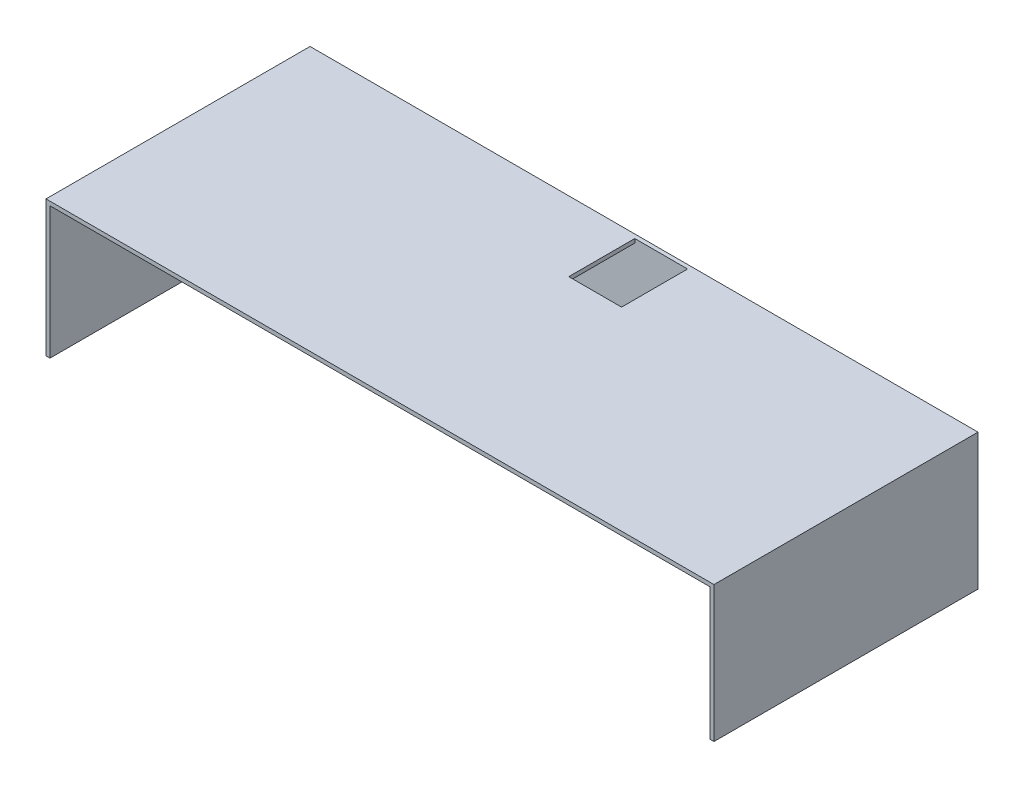
ISO-10303-21;
HEADER;
FILE_DESCRIPTION(('STEP AP214'),'2;1');
FILE_NAME('part.step','',(''),(''),'','','');
FILE_SCHEMA(('AUTOMOTIVE_DESIGN { 1 0 10303 214 1 1 1 1 }'));
ENDSEC;
DATA;
#1=APPLICATION_CONTEXT('core data for automotive mechanical design processes');
#2=APPLICATION_PROTOCOL_DEFINITION('international standard','automotive_design',2000,#1);
#3=PRODUCT_CONTEXT('',#1,'mechanical');
#4=PRODUCT('Part','Part','',(#3));
#5=PRODUCT_RELATED_PRODUCT_CATEGORY('part','',(#4));
#6=PRODUCT_DEFINITION_FORMATION('','',#4);
#7=PRODUCT_DEFINITION_CONTEXT('part definition',#1,'design');
#8=PRODUCT_DEFINITION('design','',#6,#7);
#9=PRODUCT_DEFINITION_SHAPE('','',#8);
#10=(LENGTH_UNIT() NAMED_UNIT(*) SI_UNIT(.MILLI.,.METRE.));
#11=(NAMED_UNIT(*) PLANE_ANGLE_UNIT() SI_UNIT($,.RADIAN.));
#12=(NAMED_UNIT(*) SI_UNIT($,.STERADIAN.) SOLID_ANGLE_UNIT());
#13=UNCERTAINTY_MEASURE_WITH_UNIT(LENGTH_MEASURE(1.E-05),#10,'distance_accuracy_value','');
#14=(GEOMETRIC_REPRESENTATION_CONTEXT(3) GLOBAL_UNCERTAINTY_ASSIGNED_CONTEXT((#13)) GLOBAL_UNIT_ASSIGNED_CONTEXT((#10,
#11,#12)) REPRESENTATION_CONTEXT('',''));
#15=CARTESIAN_POINT('',(0.,0.,0.));
#16=DIRECTION('',(0.,0.,1.));
#17=DIRECTION('',(1.,0.,0.));
#18=AXIS2_PLACEMENT_3D('',#15,#16,#17);
#19=CARTESIAN_POINT('',(-25000.,-5000.,300.));
#20=DIRECTION('',(0.,1.,0.));
#21=DIRECTION('',(0.,0.,1.));
#22=AXIS2_PLACEMENT_3D('',#19,#20,#21);
#23=PLANE('',#22);
#24=DIRECTION('',(1.,0.,0.));
#25=VECTOR('',#24,1.);
#26=CARTESIAN_POINT('',(-25000.,-5000.,0.));
#27=LINE('',#26,#25);
#28=CARTESIAN_POINT('',(-25300.,-5000.,0.));
#29=VERTEX_POINT('',#28);
#30=CARTESIAN_POINT('',(25300.,-4999.99999999999,0.));
#31=VERTEX_POINT('',#30);
#32=EDGE_CURVE('E44',#29,#31,#27,.T.);
#33=ORIENTED_EDGE('',*,*,#32,.T.);
#34=DIRECTION('',(0.,0.,-1.));
#35=VECTOR('',#34,1.);
#36=CARTESIAN_POINT('',(25300.,-4999.99999999999,20000.));
#37=LINE('',#36,#35);
#38=CARTESIAN_POINT('',(25300.,-4999.99999999999,20000.));
#39=VERTEX_POINT('',#38);
#40=EDGE_CURVE('E187',#39,#31,#37,.T.);
#41=ORIENTED_EDGE('',*,*,#40,.F.);
#42=DIRECTION('',(-1.,0.,0.));
#43=VECTOR('',#42,1.);
#44=CARTESIAN_POINT('',(25300.,-4999.99999999999,20000.));
#45=LINE('',#44,#43);
#46=CARTESIAN_POINT('',(25000.,-4999.99999999999,20000.));
#47=VERTEX_POINT('',#46);
#48=EDGE_CURVE('E195',#39,#47,#45,.T.);
#49=ORIENTED_EDGE('',*,*,#48,.T.);
#50=DIRECTION('',(0.,0.,-1.));
#51=VECTOR('',#50,1.);
#52=CARTESIAN_POINT('',(25000.,-4999.99999999999,20000.));
#53=LINE('',#52,#51);
#54=CARTESIAN_POINT('',(25000.,-4999.99999999999,300.000000000001));
#55=VERTEX_POINT('',#54);
#56=EDGE_CURVE('E184',#47,#55,#53,.T.);
#57=ORIENTED_EDGE('',*,*,#56,.T.);
#58=DIRECTION('',(1.,0.,0.));
#59=VECTOR('',#58,1.);
#60=CARTESIAN_POINT('',(-25000.,-5000.,300.));
#61=LINE('',#60,#59);
#62=CARTESIAN_POINT('',(-25000.,-5000.,300.));
#63=VERTEX_POINT('',#62);
#64=EDGE_CURVE('E11',#63,#55,#61,.T.);
#65=ORIENTED_EDGE('',*,*,#64,.F.);
#66=DIRECTION('',(0.,0.,1.));
#67=VECTOR('',#66,1.);
#68=CARTESIAN_POINT('',(-25000.,-5000.,0.));
#69=LINE('',#68,#67);
#70=CARTESIAN_POINT('',(-25000.,-5000.,20000.));
#71=VERTEX_POINT('',#70);
#72=EDGE_CURVE('E217',#63,#71,#69,.T.);
#73=ORIENTED_EDGE('',*,*,#72,.T.);
#74=DIRECTION('',(1.,0.,0.));
#75=VECTOR('',#74,1.);
#76=CARTESIAN_POINT('',(-25300.,-5000.,20000.));
#77=LINE('',#76,#75);
#78=CARTESIAN_POINT('',(-25300.,-5000.,20000.));
#79=VERTEX_POINT('',#78);
#80=EDGE_CURVE('E234',#79,#71,#77,.T.);
#81=ORIENTED_EDGE('',*,*,#80,.F.);
#82=DIRECTION('',(0.,0.,1.));
#83=VECTOR('',#82,1.);
#84=CARTESIAN_POINT('',(-25300.,-5000.,0.));
#85=LINE('',#84,#83);
#86=EDGE_CURVE('E227',#29,#79,#85,.T.);
#87=ORIENTED_EDGE('',*,*,#86,.F.);
#88=EDGE_LOOP('',(#33,#41,#49,#57,#65,#73,#81,#87));
#89=FACE_BOUND('',#88,.T.);
#90=ADVANCED_FACE('F41',(#89),#23,.F.);
#91=CARTESIAN_POINT('',(0.,0.,300.));
#92=DIRECTION('',(0.,0.,1.));
#93=DIRECTION('',(1.,0.,0.));
#94=AXIS2_PLACEMENT_3D('',#91,#92,#93);
#95=PLANE('',#94);
#96=DIRECTION('',(0.,1.,0.));
#97=VECTOR('',#96,1.);
#98=CARTESIAN_POINT('',(25000.,5000.,300.));
#99=LINE('',#98,#97);
#100=CARTESIAN_POINT('',(25000.,5000.,300.));
#101=VERTEX_POINT('',#100);
#102=EDGE_CURVE('E247',#55,#101,#99,.T.);
#103=ORIENTED_EDGE('',*,*,#102,.T.);
#104=DIRECTION('',(-1.,0.,0.));
#105=VECTOR('',#104,1.);
#106=CARTESIAN_POINT('',(-25000.,5000.,300.));
#107=LINE('',#106,#105);
#108=CARTESIAN_POINT('',(3600.,5000.,300.));
#109=VERTEX_POINT('',#108);
#110=EDGE_CURVE('E137',#101,#109,#107,.T.);
#111=ORIENTED_EDGE('',*,*,#110,.T.);
#112=DIRECTION('',(0.,-1.,0.));
#113=VECTOR('',#112,1.);
#114=CARTESIAN_POINT('',(3600.,5300.,299.999999999996));
#115=LINE('',#114,#113);
#116=CARTESIAN_POINT('',(3600.,5300.,299.999999999996));
#117=VERTEX_POINT('',#116);
#118=EDGE_CURVE('E65',#117,#109,#115,.T.);
#119=ORIENTED_EDGE('',*,*,#118,.F.);
#120=DIRECTION('',(1.,0.,0.));
#121=VECTOR('',#120,1.);
#122=CARTESIAN_POINT('',(0.,5300.,300.));
#123=LINE('',#122,#121);
#124=CARTESIAN_POINT('',(-400.,5300.,300.));
#125=VERTEX_POINT('',#124);
#126=EDGE_CURVE('E134',#125,#117,#123,.T.);
#127=ORIENTED_EDGE('',*,*,#126,.F.);
#128=DIRECTION('',(0.,-1.,0.));
#129=VECTOR('',#128,1.);
#130=CARTESIAN_POINT('',(-400.,5300.,300.));
#131=LINE('',#130,#129);
#132=CARTESIAN_POINT('',(-400.,5000.,300.));
#133=VERTEX_POINT('',#132);
#134=EDGE_CURVE('E170',#125,#133,#131,.T.);
#135=ORIENTED_EDGE('',*,*,#134,.T.);
#136=CARTESIAN_POINT('',(-25000.,5000.,300.));
#137=VERTEX_POINT('',#136);
#138=EDGE_CURVE('E250',#133,#137,#107,.T.);
#139=ORIENTED_EDGE('',*,*,#138,.T.);
#140=DIRECTION('',(0.,-1.,0.));
#141=VECTOR('',#140,1.);
#142=CARTESIAN_POINT('',(-25000.,5000.,300.));
#143=LINE('',#142,#141);
#144=EDGE_CURVE('E50',#137,#63,#143,.T.);
#145=ORIENTED_EDGE('',*,*,#144,.T.);
#146=ORIENTED_EDGE('',*,*,#64,.T.);
#147=EDGE_LOOP('',(#103,#111,#119,#127,#135,#139,#145,#146));
#148=FACE_BOUND('',#147,.T.);
#149=ADVANCED_FACE('F132',(#148),#95,.T.);
#150=CARTESIAN_POINT('',(0.,0.,0.));
#151=DIRECTION('',(0.,0.,1.));
#152=DIRECTION('',(1.,0.,0.));
#153=AXIS2_PLACEMENT_3D('',#150,#151,#152);
#154=PLANE('',#153);
#155=DIRECTION('',(-1.,0.,0.));
#156=VECTOR('',#155,1.);
#157=CARTESIAN_POINT('',(-25300.,5300.,0.));
#158=LINE('',#157,#156);
#159=CARTESIAN_POINT('',(25300.,5300.00000000001,0.));
#160=VERTEX_POINT('',#159);
#161=CARTESIAN_POINT('',(-25300.,5300.,0.));
#162=VERTEX_POINT('',#161);
#163=EDGE_CURVE('E205',#160,#162,#158,.T.);
#164=ORIENTED_EDGE('',*,*,#163,.F.);
#165=DIRECTION('',(0.,1.,0.));
#166=VECTOR('',#165,1.);
#167=CARTESIAN_POINT('',(25300.,-4999.99999999999,0.));
#168=LINE('',#167,#166);
#169=EDGE_CURVE('E191',#31,#160,#168,.T.);
#170=ORIENTED_EDGE('',*,*,#169,.F.);
#171=ORIENTED_EDGE('',*,*,#32,.F.);
#172=DIRECTION('',(0.,-1.,0.));
#173=VECTOR('',#172,1.);
#174=CARTESIAN_POINT('',(-25300.,5000.,0.));
#175=LINE('',#174,#173);
#176=EDGE_CURVE('E223',#162,#29,#175,.T.);
#177=ORIENTED_EDGE('',*,*,#176,.F.);
#178=EDGE_LOOP('',(#164,#170,#171,#177));
#179=FACE_BOUND('',#178,.T.);
#180=ADVANCED_FACE('F284',(#179),#154,.F.);
#181=CARTESIAN_POINT('',(-25300.,-5000.,20000.));
#182=DIRECTION('',(0.,0.,-1.));
#183=DIRECTION('',(-1.,0.,0.));
#184=AXIS2_PLACEMENT_3D('',#181,#182,#183);
#185=PLANE('',#184);
#186=DIRECTION('',(0.,1.,0.));
#187=VECTOR('',#186,1.);
#188=CARTESIAN_POINT('',(-25000.,-5000.,20000.));
#189=LINE('',#188,#187);
#190=CARTESIAN_POINT('',(-25000.,5000.,20000.));
#191=VERTEX_POINT('',#190);
#192=EDGE_CURVE('E237',#71,#191,#189,.T.);
#193=ORIENTED_EDGE('',*,*,#192,.T.);
#194=DIRECTION('',(1.,0.,0.));
#195=VECTOR('',#194,1.);
#196=CARTESIAN_POINT('',(25000.,5000.,20000.));
#197=LINE('',#196,#195);
#198=CARTESIAN_POINT('',(25000.,5000.,20000.));
#199=VERTEX_POINT('',#198);
#200=EDGE_CURVE('E204',#191,#199,#197,.T.);
#201=ORIENTED_EDGE('',*,*,#200,.T.);
#202=DIRECTION('',(0.,-1.,0.));
#203=VECTOR('',#202,1.);
#204=CARTESIAN_POINT('',(25000.,5300.,20000.));
#205=LINE('',#204,#203);
#206=EDGE_CURVE('E173',#199,#47,#205,.T.);
#207=ORIENTED_EDGE('',*,*,#206,.T.);
#208=ORIENTED_EDGE('',*,*,#48,.F.);
#209=DIRECTION('',(0.,-1.,0.));
#210=VECTOR('',#209,1.);
#211=CARTESIAN_POINT('',(25300.,5300.,20000.));
#212=LINE('',#211,#210);
#213=CARTESIAN_POINT('',(25300.,5300.,20000.));
#214=VERTEX_POINT('',#213);
#215=EDGE_CURVE('E183',#214,#39,#212,.T.);
#216=ORIENTED_EDGE('',*,*,#215,.F.);
#217=DIRECTION('',(1.,0.,0.));
#218=VECTOR('',#217,1.);
#219=CARTESIAN_POINT('',(25000.,5300.,20000.));
#220=LINE('',#219,#218);
#221=CARTESIAN_POINT('',(-25300.,5300.,20000.));
#222=VERTEX_POINT('',#221);
#223=EDGE_CURVE('E214',#222,#214,#220,.T.);
#224=ORIENTED_EDGE('',*,*,#223,.F.);
#225=DIRECTION('',(0.,1.,0.));
#226=VECTOR('',#225,1.);
#227=CARTESIAN_POINT('',(-25300.,-5000.,20000.));
#228=LINE('',#227,#226);
#229=EDGE_CURVE('E231',#79,#222,#228,.T.);
#230=ORIENTED_EDGE('',*,*,#229,.F.);
#231=ORIENTED_EDGE('',*,*,#80,.T.);
#232=EDGE_LOOP('',(#193,#201,#207,#208,#216,#224,#230,#231));
#233=FACE_BOUND('',#232,.T.);
#234=ADVANCED_FACE('F289',(#233),#185,.F.);
#235=CARTESIAN_POINT('',(-25300.,0.,0.));
#236=DIRECTION('',(-1.,0.,0.));
#237=DIRECTION('',(0.,0.,1.));
#238=AXIS2_PLACEMENT_3D('',#235,#236,#237);
#239=PLANE('',#238);
#240=ORIENTED_EDGE('',*,*,#176,.T.);
#241=ORIENTED_EDGE('',*,*,#86,.T.);
#242=ORIENTED_EDGE('',*,*,#229,.T.);
#243=DIRECTION('',(0.,0.,1.));
#244=VECTOR('',#243,1.);
#245=CARTESIAN_POINT('',(-25300.,5300.,0.));
#246=LINE('',#245,#244);
#247=EDGE_CURVE('E209',#162,#222,#246,.T.);
#248=ORIENTED_EDGE('',*,*,#247,.F.);
#249=EDGE_LOOP('',(#240,#241,#242,#248));
#250=FACE_BOUND('',#249,.T.);
#251=ADVANCED_FACE('F293',(#250),#239,.T.);
#252=CARTESIAN_POINT('',(-25000.,0.,0.));
#253=DIRECTION('',(-1.,0.,0.));
#254=DIRECTION('',(0.,0.,1.));
#255=AXIS2_PLACEMENT_3D('',#252,#253,#254);
#256=PLANE('',#255);
#257=ORIENTED_EDGE('',*,*,#144,.F.);
#258=DIRECTION('',(0.,0.,-1.));
#259=VECTOR('',#258,1.);
#260=CARTESIAN_POINT('',(-25000.,5000.,0.));
#261=LINE('',#260,#259);
#262=EDGE_CURVE('E228',#191,#137,#261,.T.);
#263=ORIENTED_EDGE('',*,*,#262,.F.);
#264=ORIENTED_EDGE('',*,*,#192,.F.);
#265=ORIENTED_EDGE('',*,*,#72,.F.);
#266=EDGE_LOOP('',(#257,#263,#264,#265));
#267=FACE_BOUND('',#266,.T.);
#268=ADVANCED_FACE('F291',(#267),#256,.F.);
#269=CARTESIAN_POINT('',(0.,5300.,0.));
#270=DIRECTION('',(0.,-1.,0.));
#271=DIRECTION('',(0.,0.,-1.));
#272=AXIS2_PLACEMENT_3D('',#269,#270,#271);
#273=PLANE('',#272);
#274=DIRECTION('',(0.,0.,-1.));
#275=VECTOR('',#274,1.);
#276=CARTESIAN_POINT('',(-400.000000000001,5300.,5300.));
#277=LINE('',#276,#275);
#278=CARTESIAN_POINT('',(-400.000000000001,5300.,5300.));
#279=VERTEX_POINT('',#278);
#280=EDGE_CURVE('E140',#279,#125,#277,.T.);
#281=ORIENTED_EDGE('',*,*,#280,.T.);
#282=ORIENTED_EDGE('',*,*,#126,.T.);
#283=DIRECTION('',(0.,0.,1.));
#284=VECTOR('',#283,1.);
#285=CARTESIAN_POINT('',(3600.,5300.,299.999999999996));
#286=LINE('',#285,#284);
#287=CARTESIAN_POINT('',(3600.,5300.,5300.));
#288=VERTEX_POINT('',#287);
#289=EDGE_CURVE('E143',#117,#288,#286,.T.);
#290=ORIENTED_EDGE('',*,*,#289,.T.);
#291=DIRECTION('',(-1.,0.,0.));
#292=VECTOR('',#291,1.);
#293=CARTESIAN_POINT('',(3600.,5300.,5300.));
#294=LINE('',#293,#292);
#295=EDGE_CURVE('E57',#288,#279,#294,.T.);
#296=ORIENTED_EDGE('',*,*,#295,.T.);
#297=EDGE_LOOP('',(#281,#282,#290,#296));
#298=FACE_BOUND('',#297,.T.);
#299=ORIENTED_EDGE('',*,*,#163,.T.);
#300=ORIENTED_EDGE('',*,*,#247,.T.);
#301=ORIENTED_EDGE('',*,*,#223,.T.);
#302=DIRECTION('',(0.,0.,1.));
#303=VECTOR('',#302,1.);
#304=CARTESIAN_POINT('',(25300.,5300.00000000001,0.));
#305=LINE('',#304,#303);
#306=EDGE_CURVE('E179',#160,#214,#305,.T.);
#307=ORIENTED_EDGE('',*,*,#306,.F.);
#308=EDGE_LOOP('',(#299,#300,#301,#307));
#309=FACE_BOUND('',#308,.T.);
#310=ADVANCED_FACE('F149',(#298,#309),#273,.F.);
#311=CARTESIAN_POINT('',(0.,5000.,0.));
#312=DIRECTION('',(0.,-1.,0.));
#313=DIRECTION('',(0.,0.,-1.));
#314=AXIS2_PLACEMENT_3D('',#311,#312,#313);
#315=PLANE('',#314);
#316=DIRECTION('',(0.,0.,-1.));
#317=VECTOR('',#316,1.);
#318=CARTESIAN_POINT('',(-400.000000000001,5000.,5300.));
#319=LINE('',#318,#317);
#320=CARTESIAN_POINT('',(-400.000000000001,5000.,5300.));
#321=VERTEX_POINT('',#320);
#322=EDGE_CURVE('E153',#321,#133,#319,.T.);
#323=ORIENTED_EDGE('',*,*,#322,.F.);
#324=DIRECTION('',(-1.,0.,0.));
#325=VECTOR('',#324,1.);
#326=CARTESIAN_POINT('',(3600.,5000.,5300.));
#327=LINE('',#326,#325);
#328=CARTESIAN_POINT('',(3600.,5000.,5300.));
#329=VERTEX_POINT('',#328);
#330=EDGE_CURVE('E157',#329,#321,#327,.T.);
#331=ORIENTED_EDGE('',*,*,#330,.F.);
#332=DIRECTION('',(0.,0.,1.));
#333=VECTOR('',#332,1.);
#334=CARTESIAN_POINT('',(3600.,5000.,299.999999999996));
#335=LINE('',#334,#333);
#336=EDGE_CURVE('E164',#109,#329,#335,.T.);
#337=ORIENTED_EDGE('',*,*,#336,.F.);
#338=ORIENTED_EDGE('',*,*,#110,.F.);
#339=DIRECTION('',(0.,0.,-1.));
#340=VECTOR('',#339,1.);
#341=CARTESIAN_POINT('',(25000.,5000.,0.));
#342=LINE('',#341,#340);
#343=EDGE_CURVE('E210',#199,#101,#342,.T.);
#344=ORIENTED_EDGE('',*,*,#343,.F.);
#345=ORIENTED_EDGE('',*,*,#200,.F.);
#346=ORIENTED_EDGE('',*,*,#262,.T.);
#347=ORIENTED_EDGE('',*,*,#138,.F.);
#348=EDGE_LOOP('',(#323,#331,#337,#338,#344,#345,#346,#347));
#349=FACE_BOUND('',#348,.T.);
#350=ADVANCED_FACE('F270',(#349),#315,.T.);
#351=CARTESIAN_POINT('',(25000.,0.,0.));
#352=DIRECTION('',(1.,0.,0.));
#353=DIRECTION('',(0.,0.,-1.));
#354=AXIS2_PLACEMENT_3D('',#351,#352,#353);
#355=PLANE('',#354);
#356=ORIENTED_EDGE('',*,*,#206,.F.);
#357=ORIENTED_EDGE('',*,*,#343,.T.);
#358=ORIENTED_EDGE('',*,*,#102,.F.);
#359=ORIENTED_EDGE('',*,*,#56,.F.);
#360=EDGE_LOOP('',(#356,#357,#358,#359));
#361=FACE_BOUND('',#360,.T.);
#362=ADVANCED_FACE('F266',(#361),#355,.F.);
#363=CARTESIAN_POINT('',(25300.,0.,0.));
#364=DIRECTION('',(1.,0.,0.));
#365=DIRECTION('',(0.,0.,-1.));
#366=AXIS2_PLACEMENT_3D('',#363,#364,#365);
#367=PLANE('',#366);
#368=ORIENTED_EDGE('',*,*,#306,.T.);
#369=ORIENTED_EDGE('',*,*,#215,.T.);
#370=ORIENTED_EDGE('',*,*,#40,.T.);
#371=ORIENTED_EDGE('',*,*,#169,.T.);
#372=EDGE_LOOP('',(#368,#369,#370,#371));
#373=FACE_BOUND('',#372,.T.);
#374=ADVANCED_FACE('F281',(#373),#367,.T.);
#375=CARTESIAN_POINT('',(-400.000000000001,5300.,5300.));
#376=DIRECTION('',(-1.,0.,0.));
#377=DIRECTION('',(0.,0.,1.));
#378=AXIS2_PLACEMENT_3D('',#375,#376,#377);
#379=PLANE('',#378);
#380=ORIENTED_EDGE('',*,*,#322,.T.);
#381=ORIENTED_EDGE('',*,*,#134,.F.);
#382=ORIENTED_EDGE('',*,*,#280,.F.);
#383=DIRECTION('',(0.,-1.,0.));
#384=VECTOR('',#383,1.);
#385=CARTESIAN_POINT('',(-400.000000000001,5300.,5300.));
#386=LINE('',#385,#384);
#387=EDGE_CURVE('E174',#279,#321,#386,.T.);
#388=ORIENTED_EDGE('',*,*,#387,.T.);
#389=EDGE_LOOP('',(#380,#381,#382,#388));
#390=FACE_BOUND('',#389,.T.);
#391=ADVANCED_FACE('F274',(#390),#379,.F.);
#392=CARTESIAN_POINT('',(3600.,5300.,5300.));
#393=DIRECTION('',(0.,0.,1.));
#394=DIRECTION('',(1.,0.,0.));
#395=AXIS2_PLACEMENT_3D('',#392,#393,#394);
#396=PLANE('',#395);
#397=ORIENTED_EDGE('',*,*,#330,.T.);
#398=ORIENTED_EDGE('',*,*,#387,.F.);
#399=ORIENTED_EDGE('',*,*,#295,.F.);
#400=DIRECTION('',(0.,-1.,0.));
#401=VECTOR('',#400,1.);
#402=CARTESIAN_POINT('',(3600.,5300.,5300.));
#403=LINE('',#402,#401);
#404=EDGE_CURVE('E139',#288,#329,#403,.T.);
#405=ORIENTED_EDGE('',*,*,#404,.T.);
#406=EDGE_LOOP('',(#397,#398,#399,#405));
#407=FACE_BOUND('',#406,.T.);
#408=ADVANCED_FACE('F272',(#407),#396,.F.);
#409=CARTESIAN_POINT('',(3600.,5300.,299.999999999996));
#410=DIRECTION('',(1.,0.,0.));
#411=DIRECTION('',(0.,0.,-1.));
#412=AXIS2_PLACEMENT_3D('',#409,#410,#411);
#413=PLANE('',#412);
#414=ORIENTED_EDGE('',*,*,#336,.T.);
#415=ORIENTED_EDGE('',*,*,#404,.F.);
#416=ORIENTED_EDGE('',*,*,#289,.F.);
#417=ORIENTED_EDGE('',*,*,#118,.T.);
#418=EDGE_LOOP('',(#414,#415,#416,#417));
#419=FACE_BOUND('',#418,.T.);
#420=ADVANCED_FACE('F144',(#419),#413,.F.);
#421=CLOSED_SHELL('',(#90,#149,#180,#234,#251,#268,#310,#350,#362,#374,#391,#408,#420));
#422=MANIFOLD_SOLID_BREP('B2',#421);
#423=ADVANCED_BREP_SHAPE_REPRESENTATION('',(#18,#422),#14);
#424=SHAPE_DEFINITION_REPRESENTATION(#9,#423);
ENDSEC;
END-ISO-10303-21;
